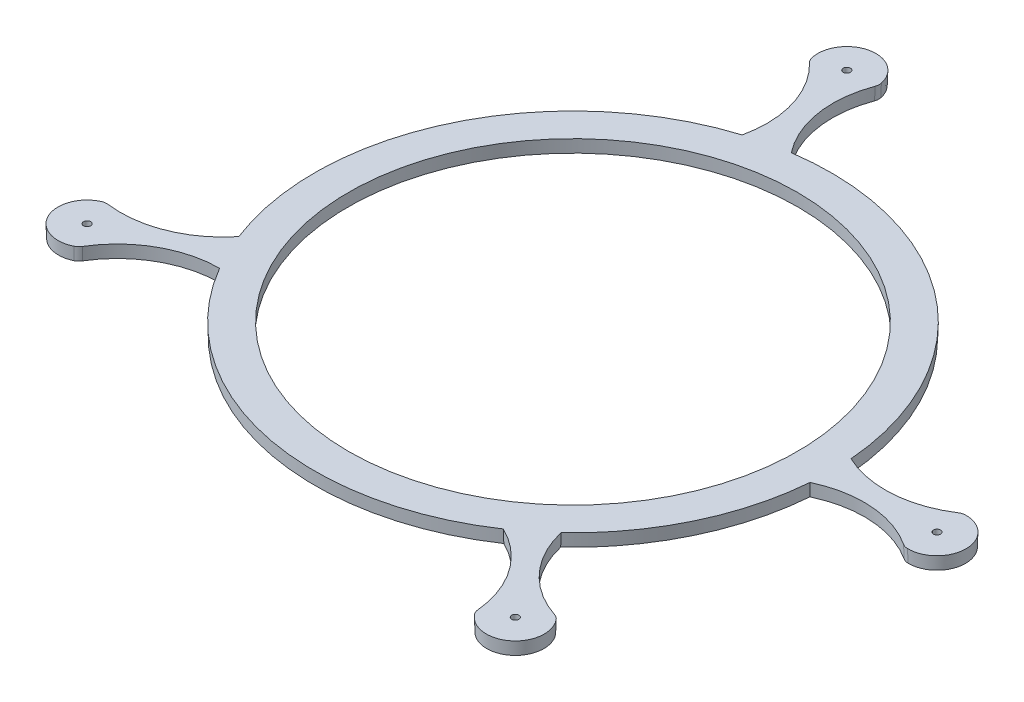
ISO-10303-21;
HEADER;
FILE_DESCRIPTION(('STEP AP214'),'2;1');
FILE_NAME('part.step','',(''),(''),'','','');
FILE_SCHEMA(('AUTOMOTIVE_DESIGN { 1 0 10303 214 1 1 1 1 }'));
ENDSEC;
DATA;
#1=APPLICATION_CONTEXT('core data for automotive mechanical design processes');
#2=APPLICATION_PROTOCOL_DEFINITION('international standard','automotive_design',2000,#1);
#3=PRODUCT_CONTEXT('',#1,'mechanical');
#4=PRODUCT('Part','Part','',(#3));
#5=PRODUCT_RELATED_PRODUCT_CATEGORY('part','',(#4));
#6=PRODUCT_DEFINITION_FORMATION('','',#4);
#7=PRODUCT_DEFINITION_CONTEXT('part definition',#1,'design');
#8=PRODUCT_DEFINITION('design','',#6,#7);
#9=PRODUCT_DEFINITION_SHAPE('','',#8);
#10=(LENGTH_UNIT() NAMED_UNIT(*) SI_UNIT(.MILLI.,.METRE.));
#11=(NAMED_UNIT(*) PLANE_ANGLE_UNIT() SI_UNIT($,.RADIAN.));
#12=(NAMED_UNIT(*) SI_UNIT($,.STERADIAN.) SOLID_ANGLE_UNIT());
#13=UNCERTAINTY_MEASURE_WITH_UNIT(LENGTH_MEASURE(1.E-05),#10,'distance_accuracy_value','');
#14=(GEOMETRIC_REPRESENTATION_CONTEXT(3) GLOBAL_UNCERTAINTY_ASSIGNED_CONTEXT((#13)) GLOBAL_UNIT_ASSIGNED_CONTEXT((#10,
#11,#12)) REPRESENTATION_CONTEXT('',''));
#15=CARTESIAN_POINT('',(0.,0.,0.));
#16=DIRECTION('',(0.,0.,1.));
#17=DIRECTION('',(1.,0.,0.));
#18=AXIS2_PLACEMENT_3D('',#15,#16,#17);
#19=CARTESIAN_POINT('',(0.,0.,0.));
#20=DIRECTION('',(0.,1.,0.));
#21=DIRECTION('',(0.,0.,1.));
#22=AXIS2_PLACEMENT_3D('',#19,#20,#21);
#23=CONICAL_SURFACE('',#22,63.5,0.0349065850398867);
#24=CARTESIAN_POINT('',(-8.47365887755398,49.046800738389,-64.6598803867296));
#25=CARTESIAN_POINT('',(-8.539047421525,44.9595926190922,-64.5073623180231));
#26=CARTESIAN_POINT('',(-8.60381314379772,40.8723777055365,-64.3547595359883));
#27=CARTESIAN_POINT('',(-8.73212595212953,32.6979352936555,-64.0493882466624));
#28=CARTESIAN_POINT('',(-8.79567303829411,28.6107077953313,-63.8966197393857));
#29=CARTESIAN_POINT('',(-8.92157559257824,20.4362405311925,-63.5909206753609));
#30=CARTESIAN_POINT('',(-8.98393106070393,16.3490007653779,-63.4379901186137));
#31=CARTESIAN_POINT('',(-9.10747515676641,8.17450918370875,-63.1319703237221));
#32=CARTESIAN_POINT('',(-9.1686637846022,4.08725736785326,-62.978881085564));
#33=CARTESIAN_POINT('',(-9.22928137565886,0.,-62.8257142043679));
#34=B_SPLINE_CURVE_WITH_KNOTS('',3,(#24,#25,#26,#27,#28,#29,#30,#31,#32,#33),.UNSPECIFIED.,.F.,
.F.,(4,2,2,2,4),(0.,12.2717263336298,24.5434516050845,36.8151768132926,49.0869030836614),.UNSPECIFIED.);
#35=CARTESIAN_POINT('',(-9.18207836544071,3.175,-62.9446793390006));
#36=VERTEX_POINT('',#35);
#37=CARTESIAN_POINT('',(-9.22928137565885,0.,-62.8257142043679));
#38=VERTEX_POINT('',#37);
#39=EDGE_CURVE('E65',#36,#38,#34,.T.);
#40=ORIENTED_EDGE('',*,*,#39,.F.);
#41=CARTESIAN_POINT('',(0.,3.175,0.));
#42=DIRECTION('',(0.,1.,0.));
#43=DIRECTION('',(0.,0.,1.));
#44=AXIS2_PLACEMENT_3D('',#41,#42,#43);
#45=CIRCLE('',#44,63.6108734431363);
#46=CARTESIAN_POINT('',(63.4097294644642,3.175,-5.05464434378554));
#47=VERTEX_POINT('',#46);
#48=EDGE_CURVE('E11',#47,#36,#45,.T.);
#49=ORIENTED_EDGE('',*,*,#48,.F.);
#50=CARTESIAN_POINT('',(63.4097294644642,3.175,-5.05464434378554));
#51=CARTESIAN_POINT('',(63.3921564897682,2.64583352104839,-5.04254423693743));
#52=CARTESIAN_POINT('',(63.3745801047194,2.11666694823912,-5.03045320309109));
#53=CARTESIAN_POINT('',(63.3394205139158,1.05833361490579,-5.00628928140196));
#54=CARTESIAN_POINT('',(63.3218373081612,0.529166854381727,-4.99421639355917));
#55=CARTESIAN_POINT('',(63.3042506920536,0.,-4.98215257871815));
#56=B_SPLINE_CURVE_WITH_KNOTS('',3,(#50,#51,#52,#53,#54,#55),.UNSPECIFIED.,.F.,.F.,(4,2,4),(0.,
1.58878930563687,3.17757861127216),.UNSPECIFIED.);
#57=CARTESIAN_POINT('',(63.3042506920536,0.,-4.98215257871816));
#58=VERTEX_POINT('',#57);
#59=EDGE_CURVE('E414',#47,#58,#56,.T.);
#60=ORIENTED_EDGE('',*,*,#59,.T.);
#61=CARTESIAN_POINT('',(0.,0.,0.));
#62=DIRECTION('',(0.,1.,0.));
#63=DIRECTION('',(0.,0.,1.));
#64=AXIS2_PLACEMENT_3D('',#61,#62,#63);
#65=CIRCLE('',#64,63.5);
#66=EDGE_CURVE('E384',#58,#38,#65,.T.);
#67=ORIENTED_EDGE('',*,*,#66,.T.);
#68=EDGE_LOOP('',(#40,#49,#60,#67));
#69=FACE_BOUND('',#68,.T.);
#70=ADVANCED_FACE('F39',(#69),#23,.T.);
#71=CARTESIAN_POINT('',(-19.0379060792577,3.175,-60.6951509786084));
#72=VERTEX_POINT('',#71);
#73=CARTESIAN_POINT('',(-59.3233201573882,3.175,22.9583733244044));
#74=VERTEX_POINT('',#73);
#75=EDGE_CURVE('E48',#72,#74,#45,.T.);
#76=ORIENTED_EDGE('',*,*,#75,.F.);
#77=CARTESIAN_POINT('',(-19.0379060792577,3.175,-60.6951509786084));
#78=CARTESIAN_POINT('',(-19.0221989926094,2.64583352104839,-60.6807111221541));
#79=CARTESIAN_POINT('',(-19.0064999926088,2.11666694823912,-60.6662659219186));
#80=CARTESIAN_POINT('',(-18.9751181659032,1.05833361490579,-60.6373648338857));
#81=CARTESIAN_POINT('',(-18.9594353391981,0.529166854381727,-60.6229089460882));
#82=CARTESIAN_POINT('',(-18.9437605991408,0.,-60.6084477145096));
#83=B_SPLINE_CURVE_WITH_KNOTS('',3,(#77,#78,#79,#80,#81,#82),.UNSPECIFIED.,.F.,.F.,(4,2,4),(0.,
1.58878930563687,3.17757861127216),.UNSPECIFIED.);
#84=CARTESIAN_POINT('',(-18.9437605991408,0.,-60.6084477145096));
#85=VERTEX_POINT('',#84);
#86=EDGE_CURVE('E280',#72,#85,#83,.T.);
#87=ORIENTED_EDGE('',*,*,#86,.T.);
#88=CARTESIAN_POINT('',(-59.1968340691391,0.,22.9779206237383));
#89=VERTEX_POINT('',#88);
#90=EDGE_CURVE('E324',#85,#89,#65,.T.);
#91=ORIENTED_EDGE('',*,*,#90,.T.);
#92=CARTESIAN_POINT('',(-61.1531556999002,49.046800738389,22.6493835311935));
#93=CARTESIAN_POINT('',(-60.9899112577316,44.9595926190922,22.679194184754));
#94=CARTESIAN_POINT('',(-60.8267228170408,40.8723777055365,22.7083787815676));
#95=CARTESIAN_POINT('',(-60.5004555375495,32.6979352936555,22.7655230153965));
#96=CARTESIAN_POINT('',(-60.3373766987396,28.6107077953313,22.7934826525178));
#97=CARTESIAN_POINT('',(-60.0113261945272,20.4362405311925,22.8482041256681));
#98=CARTESIAN_POINT('',(-59.8483545291241,16.3490007653779,22.8749659617031));
#99=CARTESIAN_POINT('',(-59.5225161417635,8.17450918370876,22.9273167387713));
#100=CARTESIAN_POINT('',(-59.3596494198151,4.08725736785326,22.9529056797029));
#101=CARTESIAN_POINT('',(-59.196834069139,0.,22.9779206237383));
#102=B_SPLINE_CURVE_WITH_KNOTS('',3,(#92,#93,#94,#95,#96,#97,#98,#99,#100,#101),.UNSPECIFIED.,
.F.,.F.,(4,2,2,2,4),(0.,12.2717263336298,24.5434516050845,36.8151768132926,49.0869030836614),.UNSPECIFIED.);
#103=EDGE_CURVE('E242',#74,#89,#102,.T.);
#104=ORIENTED_EDGE('',*,*,#103,.F.);
#105=EDGE_LOOP('',(#76,#87,#91,#104));
#106=FACE_BOUND('',#105,.T.);
#107=ADVANCED_FACE('F524',(#106),#23,.T.);
#108=CARTESIAN_POINT('',(-54.9370641818061,3.175,32.066527708544));
#109=VERTEX_POINT('',#108);
#110=CARTESIAN_POINT('',(35.5834395790641,3.175,52.7272419904721));
#111=VERTEX_POINT('',#110);
#112=EDGE_CURVE('E493',#109,#111,#45,.T.);
#113=ORIENTED_EDGE('',*,*,#112,.F.);
#114=CARTESIAN_POINT('',(-54.9370641818061,3.175,32.066527708544));
#115=CARTESIAN_POINT('',(-54.9264815182916,2.64583352104839,32.0480012610071));
#116=CARTESIAN_POINT('',(-54.9158918455273,2.11666694823913,32.0294815082656));
#117=CARTESIAN_POINT('',(-54.8946984814994,1.05833361490579,31.9924553923736));
#118=CARTESIAN_POINT('',(-54.8840947902357,0.529166854381726,31.9739490292231));
#119=CARTESIAN_POINT('',(-54.8734840897223,0.,31.955449360868));
#120=B_SPLINE_CURVE_WITH_KNOTS('',3,(#114,#115,#116,#117,#118,#119),.UNSPECIFIED.,.F.,.F.,(4,2,
4),(0.,1.58878930563687,3.17757861127217),.UNSPECIFIED.);
#121=CARTESIAN_POINT('',(-54.8734840897223,0.,31.955449360868));
#122=VERTEX_POINT('',#121);
#123=EDGE_CURVE('E211',#109,#122,#120,.T.);
#124=ORIENTED_EDGE('',*,*,#123,.T.);
#125=CARTESIAN_POINT('',(35.5743509843029,0.,52.5995774892311));
#126=VERTEX_POINT('',#125);
#127=EDGE_CURVE('E487',#122,#126,#65,.T.);
#128=ORIENTED_EDGE('',*,*,#127,.T.);
#129=CARTESIAN_POINT('',(35.6893735189898,49.046800738389,54.5799564329375));
#130=CARTESIAN_POINT('',(35.6821114514918,44.9595926190922,54.4141713752868));
#131=CARTESIAN_POINT('',(35.6742514852977,40.8723777055365,54.2485802257717));
#132=CARTESIAN_POINT('',(35.6573616941259,32.6979352936555,53.9177773598822));
#133=CARTESIAN_POINT('',(35.6483318692495,28.6107077953313,53.7525656434749));
#134=CARTESIAN_POINT('',(35.6291282981051,20.4362405311925,53.4225132328244));
#135=CARTESIAN_POINT('',(35.618954551843,16.3490007653779,53.2576725385793));
#136=CARTESIAN_POINT('',(35.5974869233569,8.17450918370876,52.9283544560747));
#137=CARTESIAN_POINT('',(35.5861930410359,4.08725736785327,52.7638770678465));
#138=CARTESIAN_POINT('',(35.5743509843029,0.,52.5995774892311));
#139=B_SPLINE_CURVE_WITH_KNOTS('',3,(#129,#130,#131,#132,#133,#134,#135,#136,#137,#138),
.UNSPECIFIED.,.F.,.F.,(4,2,2,2,4),(0.,12.2717263336298,24.5434516050845,36.8151768132926,
49.0869030836614),.UNSPECIFIED.);
#140=EDGE_CURVE('E365',#111,#126,#139,.T.);
#141=ORIENTED_EDGE('',*,*,#140,.F.);
#142=EDGE_LOOP('',(#113,#124,#128,#141));
#143=FACE_BOUND('',#142,.T.);
#144=ADVANCED_FACE('F492',(#143),#23,.T.);
#145=CARTESIAN_POINT('',(43.4871997403651,3.175,46.4242035897256));
#146=VERTEX_POINT('',#145);
#147=CARTESIAN_POINT('',(63.4097294644642,3.175,5.05464434378554));
#148=VERTEX_POINT('',#147);
#149=EDGE_CURVE('E50',#146,#148,#45,.T.);
#150=ORIENTED_EDGE('',*,*,#149,.F.);
#151=CARTESIAN_POINT('',(43.4871997403651,3.175,46.4242035897256));
#152=CARTESIAN_POINT('',(43.4667829253788,2.64583352104839,46.4180087780889));
#153=CARTESIAN_POINT('',(43.4463710776306,2.11666694823912,46.4118056432069));
#154=CARTESIAN_POINT('',(43.4055573166106,1.05833361490579,46.399382726952));
#155=CARTESIAN_POINT('',(43.3851554033388,0.529166854381726,46.3931629455793));
#156=CARTESIAN_POINT('',(43.3647584573052,0.,46.3869348409612));
#157=B_SPLINE_CURVE_WITH_KNOTS('',3,(#151,#152,#153,#154,#155,#156),.UNSPECIFIED.,.F.,.F.,(4,2,
4),(0.,1.58878930563687,3.17757861127217),.UNSPECIFIED.);
#158=CARTESIAN_POINT('',(43.3647584573052,0.,46.3869348409612));
#159=VERTEX_POINT('',#158);
#160=EDGE_CURVE('E437',#146,#159,#157,.T.);
#161=ORIENTED_EDGE('',*,*,#160,.T.);
#162=CARTESIAN_POINT('',(63.3042506920536,0.,4.98215257871815));
#163=VERTEX_POINT('',#162);
#164=EDGE_CURVE('E386',#159,#163,#65,.T.);
#165=ORIENTED_EDGE('',*,*,#164,.T.);
#166=CARTESIAN_POINT('',(64.9242886748213,49.046800738389,6.12697041512335));
#167=CARTESIAN_POINT('',(64.7901448724018,44.9595926190922,6.02928283537529));
#168=CARTESIAN_POINT('',(64.6557798897279,40.8723777055365,5.93218361139628));
#169=CARTESIAN_POINT('',(64.3866171821337,32.6979352936555,5.73913636855893));
#170=CARTESIAN_POINT('',(64.2518194572509,28.6107077953313,5.64318834960094));
#171=CARTESIAN_POINT('',(63.981800860972,20.4362405311925,5.45241799397799));
#172=CARTESIAN_POINT('',(63.8465799895782,16.3490007653779,5.35759565730723));
#173=CARTESIAN_POINT('',(63.5757238974988,8.17450918370876,5.16905325910225));
#174=CARTESIAN_POINT('',(63.4400886767774,4.08725736785328,5.07533319766345));
#175=CARTESIAN_POINT('',(63.3042506920536,0.,4.98215257871815));
#176=B_SPLINE_CURVE_WITH_KNOTS('',3,(#166,#167,#168,#169,#170,#171,#172,#173,#174,#175),
.UNSPECIFIED.,.F.,.F.,(4,2,2,2,4),(0.,12.2717263336298,24.5434516050845,36.8151768132926,
49.0869030836614),.UNSPECIFIED.);
#177=EDGE_CURVE('E383',#148,#163,#176,.T.);
#178=ORIENTED_EDGE('',*,*,#177,.F.);
#179=EDGE_LOOP('',(#150,#161,#165,#178));
#180=FACE_BOUND('',#179,.T.);
#181=ADVANCED_FACE('F246',(#180),#23,.T.);
#182=CARTESIAN_POINT('',(0.,3.175,0.));
#183=DIRECTION('',(0.,1.,0.));
#184=DIRECTION('',(0.,0.,1.));
#185=AXIS2_PLACEMENT_3D('',#182,#183,#184);
#186=PLANE('',#185);
#187=CARTESIAN_POINT('',(-19.9433819321121,3.175,-87.3776653873685));
#188=DIRECTION('',(0.,1.,0.));
#189=DIRECTION('',(0.974927912181826,0.,-0.222520933956305));
#190=AXIS2_PLACEMENT_3D('',#187,#188,#189);
#191=CIRCLE('',#190,0.889000000000003);
#192=CARTESIAN_POINT('',(-19.0766710181824,3.175,-87.5754864976557));
#193=VERTEX_POINT('',#192);
#194=EDGE_CURVE('E789',#193,#193,#191,.T.);
#195=ORIENTED_EDGE('',*,*,#194,.F.);
#196=EDGE_LOOP('',(#195));
#197=FACE_BOUND('',#196,.T.);
#198=CARTESIAN_POINT('',(-80.749104913648,3.175,38.8867194178386));
#199=DIRECTION('',(0.,1.,0.));
#200=DIRECTION('',(-0.433883739117553,0.,-0.900968867902422));
#201=AXIS2_PLACEMENT_3D('',#198,#199,#200);
#202=CIRCLE('',#201,0.889000000000003);
#203=CARTESIAN_POINT('',(-81.1348275577235,3.175,38.0857580942733));
#204=VERTEX_POINT('',#203);
#205=EDGE_CURVE('E784',#204,#204,#202,.T.);
#206=ORIENTED_EDGE('',*,*,#205,.F.);
#207=EDGE_LOOP('',(#206));
#208=FACE_BOUND('',#207,.T.);
#209=CARTESIAN_POINT('',(55.8801144151554,3.175,70.0714471406591));
#210=DIRECTION('',(0.,1.,0.));
#211=DIRECTION('',(-0.781831482468031,0.,0.623489801858732));
#212=AXIS2_PLACEMENT_3D('',#209,#210,#211);
#213=CIRCLE('',#212,0.889000000000003);
#214=CARTESIAN_POINT('',(55.1850662272413,3.175,70.6257295745115));
#215=VERTEX_POINT('',#214);
#216=EDGE_CURVE('E328',#215,#215,#213,.T.);
#217=ORIENTED_EDGE('',*,*,#216,.F.);
#218=EDGE_LOOP('',(#217));
#219=FACE_BOUND('',#218,.T.);
#220=ORIENTED_EDGE('',*,*,#48,.T.);
#221=CARTESIAN_POINT('',(10.6601417901242,3.175,-78.6235256392601));
#222=DIRECTION('',(0.,1.,0.));
#223=DIRECTION('',(0.,0.,1.));
#224=AXIS2_PLACEMENT_3D('',#221,#222,#223);
#225=CIRCLE('',#224,25.2891265568637);
#226=CARTESIAN_POINT('',(-13.0561756989304,3.175,-87.4028312363691));
#227=VERTEX_POINT('',#226);
#228=EDGE_CURVE('E282',#36,#227,#225,.F.);
#229=ORIENTED_EDGE('',*,*,#228,.T.);
#230=CARTESIAN_POINT('',(-15.5421831163618,3.175,-88.3231013771437));
#231=DIRECTION('',(0.,1.,0.));
#232=DIRECTION('',(0.,0.,1.));
#233=AXIS2_PLACEMENT_3D('',#230,#231,#232);
#234=CIRCLE('',#233,2.6508734431363);
#235=CARTESIAN_POINT('',(-12.950433131829,3.175,-88.8798437135971));
#236=VERTEX_POINT('',#235);
#237=EDGE_CURVE('E284',#227,#236,#234,.T.);
#238=ORIENTED_EDGE('',*,*,#237,.T.);
#239=CARTESIAN_POINT('',(-19.9433819321121,3.175,-87.3776653873685));
#240=DIRECTION('',(0.,1.,0.));
#241=DIRECTION('',(0.,0.,1.));
#242=AXIS2_PLACEMENT_3D('',#239,#240,#241);
#243=CIRCLE('',#242,7.15247318395328);
#244=CARTESIAN_POINT('',(-26.8955818450081,3.175,-85.6969545204139));
#245=VERTEX_POINT('',#244);
#246=EDGE_CURVE('E286',#236,#245,#243,.T.);
#247=ORIENTED_EDGE('',*,*,#246,.T.);
#248=CARTESIAN_POINT('',(-24.318934348892,3.175,-86.3198651819731));
#249=DIRECTION('',(0.,1.,0.));
#250=DIRECTION('',(0.,0.,1.));
#251=AXIS2_PLACEMENT_3D('',#248,#249,#250);
#252=CIRCLE('',#251,2.6508734431363);
#253=CARTESIAN_POINT('',(-26.1594593876947,3.175,-84.4120922413259));
#254=VERTEX_POINT('',#253);
#255=EDGE_CURVE('E288',#254,#245,#252,.F.);
#256=ORIENTED_EDGE('',*,*,#255,.F.);
#257=CARTESIAN_POINT('',(-43.7179251672936,3.175,-66.2120867062794));
#258=DIRECTION('',(0.,1.,0.));
#259=DIRECTION('',(0.,0.,1.));
#260=AXIS2_PLACEMENT_3D('',#257,#258,#259);
#261=CIRCLE('',#260,25.2891265568637);
#262=EDGE_CURVE('E86',#72,#254,#261,.T.);
#263=ORIENTED_EDGE('',*,*,#262,.F.);
#264=ORIENTED_EDGE('',*,*,#75,.T.);
#265=CARTESIAN_POINT('',(-79.0243744071031,3.175,7.10251057717865));
#266=DIRECTION('',(0.,1.,0.));
#267=DIRECTION('',(0.,0.,1.));
#268=AXIS2_PLACEMENT_3D('',#265,#266,#267);
#269=CIRCLE('',#268,25.2891265568637);
#270=CARTESIAN_POINT('',(-82.3061873656297,3.175,32.1777897523806));
#271=VERTEX_POINT('',#270);
#272=EDGE_CURVE('E224',#74,#271,#269,.F.);
#273=ORIENTED_EDGE('',*,*,#272,.T.);
#274=CARTESIAN_POINT('',(-82.6501957202693,3.175,34.8062471447428));
#275=DIRECTION('',(0.,1.,0.));
#276=DIRECTION('',(0.,0.,1.));
#277=AXIS2_PLACEMENT_3D('',#274,#275,#276);
#278=CIRCLE('',#277,2.6508734431363);
#279=CARTESIAN_POINT('',(-83.7696979911105,3.175,32.4033645681056));
#280=VERTEX_POINT('',#279);
#281=EDGE_CURVE('E232',#271,#280,#278,.T.);
#282=ORIENTED_EDGE('',*,*,#281,.T.);
#283=CARTESIAN_POINT('',(-80.749104913648,3.175,38.8867194178386));
#284=DIRECTION('',(0.,1.,0.));
#285=DIRECTION('',(0.,0.,1.));
#286=AXIS2_PLACEMENT_3D('',#283,#284,#285);
#287=CIRCLE('',#286,7.15247318395328);
#288=CARTESIAN_POINT('',(-77.563522959478,3.175,45.2906198121637));
#289=VERTEX_POINT('',#288);
#290=EDGE_CURVE('E229',#280,#289,#287,.T.);
#291=ORIENTED_EDGE('',*,*,#290,.T.);
#292=CARTESIAN_POINT('',(-78.7441739575397,3.175,42.9171849105282));
#293=DIRECTION('',(0.,1.,0.));
#294=DIRECTION('',(0.,0.,1.));
#295=AXIS2_PLACEMENT_3D('',#292,#293,#294);
#296=CIRCLE('',#295,2.6508734431363);
#297=CARTESIAN_POINT('',(-76.4746775169931,3.175,44.287044727397));
#298=VERTEX_POINT('',#297);
#299=EDGE_CURVE('E214',#298,#289,#296,.F.);
#300=ORIENTED_EDGE('',*,*,#299,.F.);
#301=CARTESIAN_POINT('',(-54.8238579148962,3.175,57.3554008813487));
#302=DIRECTION('',(0.,1.,0.));
#303=DIRECTION('',(0.,0.,1.));
#304=AXIS2_PLACEMENT_3D('',#301,#302,#303);
#305=CIRCLE('',#304,25.2891265568637);
#306=EDGE_CURVE('E204',#109,#298,#305,.T.);
#307=ORIENTED_EDGE('',*,*,#306,.F.);
#308=ORIENTED_EDGE('',*,*,#112,.T.);
#309=CARTESIAN_POINT('',(24.5090134066405,3.175,75.4626110651233));
#310=DIRECTION('',(0.,1.,0.));
#311=DIRECTION('',(0.,0.,1.));
#312=AXIS2_PLACEMENT_3D('',#309,#310,#311);
#313=CIRCLE('',#312,25.2891265568637);
#314=CARTESIAN_POINT('',(49.6858750648977,3.175,73.0823675796695));
#315=VERTEX_POINT('',#314);
#316=EDGE_CURVE('E438',#111,#315,#313,.F.);
#317=ORIENTED_EDGE('',*,*,#316,.T.);
#318=CARTESIAN_POINT('',(52.3249806030554,3.175,72.8328641328185));
#319=DIRECTION('',(0.,1.,0.));
#320=DIRECTION('',(0.,0.,1.));
#321=AXIS2_PLACEMENT_3D('',#318,#319,#320);
#322=CIRCLE('',#321,2.6508734431363);
#323=CARTESIAN_POINT('',(50.2314560002703,3.175,74.4589898195533));
#324=VERTEX_POINT('',#323);
#325=EDGE_CURVE('E809',#315,#324,#322,.T.);
#326=ORIENTED_EDGE('',*,*,#325,.T.);
#327=CARTESIAN_POINT('',(55.8801144151554,3.175,70.0714471406591));
#328=DIRECTION('',(0.,1.,0.));
#329=DIRECTION('',(0.,0.,1.));
#330=AXIS2_PLACEMENT_3D('',#327,#328,#329);
#331=CIRCLE('',#330,7.15247318395328);
#332=CARTESIAN_POINT('',(61.4145969847788,3.175,65.5407324802876));
#333=VERTEX_POINT('',#332);
#334=EDGE_CURVE('E808',#324,#333,#331,.T.);
#335=ORIENTED_EDGE('',*,*,#334,.T.);
#336=CARTESIAN_POINT('',(59.363388614193,3.175,67.2199210438396));
#337=DIRECTION('',(0.,1.,0.));
#338=DIRECTION('',(0.,0.,1.));
#339=AXIS2_PLACEMENT_3D('',#336,#337,#338);
#340=CIRCLE('',#339,2.6508734431363);
#341=CARTESIAN_POINT('',(60.1938927178737,3.175,64.7025031315146));
#342=VERTEX_POINT('',#341);
#343=EDGE_CURVE('E807',#342,#333,#340,.F.);
#344=ORIENTED_EDGE('',*,*,#343,.F.);
#345=CARTESIAN_POINT('',(68.116837299916,3.175,40.6865319631659));
#346=DIRECTION('',(0.,1.,0.));
#347=DIRECTION('',(0.,0.,1.));
#348=AXIS2_PLACEMENT_3D('',#345,#346,#347);
#349=CIRCLE('',#348,25.2891265568637);
#350=EDGE_CURVE('E357',#146,#342,#349,.T.);
#351=ORIENTED_EDGE('',*,*,#350,.F.);
#352=ORIENTED_EDGE('',*,*,#149,.T.);
#353=CARTESIAN_POINT('',(74.280164992613,3.175,27.8882501351937));
#354=DIRECTION('',(0.,1.,0.));
#355=DIRECTION('',(0.,0.,1.));
#356=AXIS2_PLACEMENT_3D('',#353,#354,#355);
#357=CIRCLE('',#356,25.2891265568637);
#358=CARTESIAN_POINT('',(88.1167321864774,3.175,6.7201295219048));
#359=VERTEX_POINT('',#358);
#360=EDGE_CURVE('E396',#148,#359,#357,.F.);
#361=ORIENTED_EDGE('',*,*,#360,.T.);
#362=CARTESIAN_POINT('',(89.5671179258152,3.175,4.50123087197718));
#363=DIRECTION('',(0.,1.,0.));
#364=DIRECTION('',(0.,0.,1.));
#365=AXIS2_PLACEMENT_3D('',#362,#363,#364);
#366=CIRCLE('',#365,2.6508734431363);
#367=CARTESIAN_POINT('',(89.5331829423775,3.175,7.15188709797564));
#368=VERTEX_POINT('',#367);
#369=EDGE_CURVE('E504',#359,#368,#366,.T.);
#370=ORIENTED_EDGE('',*,*,#369,.T.);
#371=CARTESIAN_POINT('',(89.6247448612103,3.175,0.));
#372=DIRECTION('',(0.,1.,0.));
#373=DIRECTION('',(0.,0.,1.));
#374=AXIS2_PLACEMENT_3D('',#371,#372,#373);
#375=CIRCLE('',#374,7.15247318395328);
#376=CARTESIAN_POINT('',(89.5331829423775,3.175,-7.15188709797564));
#377=VERTEX_POINT('',#376);
#378=EDGE_CURVE('E505',#368,#377,#375,.T.);
#379=ORIENTED_EDGE('',*,*,#378,.T.);
#380=CARTESIAN_POINT('',(89.5671179258152,3.175,-4.50123087197718));
#381=DIRECTION('',(0.,1.,0.));
#382=DIRECTION('',(0.,0.,1.));
#383=AXIS2_PLACEMENT_3D('',#380,#381,#382);
#384=CIRCLE('',#383,2.6508734431363);
#385=CARTESIAN_POINT('',(88.1167321864774,3.175,-6.72012952190481));
#386=VERTEX_POINT('',#385);
#387=EDGE_CURVE('E507',#386,#377,#384,.F.);
#388=ORIENTED_EDGE('',*,*,#387,.F.);
#389=CARTESIAN_POINT('',(74.280164992613,3.175,-27.8882501351937));
#390=DIRECTION('',(0.,1.,0.));
#391=DIRECTION('',(0.,0.,1.));
#392=AXIS2_PLACEMENT_3D('',#389,#390,#391);
#393=CIRCLE('',#392,25.2891265568637);
#394=EDGE_CURVE('E378',#47,#386,#393,.T.);
#395=ORIENTED_EDGE('',*,*,#394,.F.);
#396=EDGE_LOOP('',(#220,#229,#238,#247,#256,#263,#264,#273,#282,#291,#300,#307,#308,#317,#326,
#335,#344,#351,#352,#361,#370,#379,#388,#395));
#397=FACE_BOUND('',#396,.T.);
#398=CARTESIAN_POINT('',(0.,3.175,0.));
#399=DIRECTION('',(0.,1.,0.));
#400=DIRECTION('',(0.,0.,1.));
#401=AXIS2_PLACEMENT_3D('',#398,#399,#400);
#402=CIRCLE('',#401,55.2611265568637);
#403=CARTESIAN_POINT('',(0.,3.175,55.2611265568637));
#404=VERTEX_POINT('',#403);
#405=EDGE_CURVE('E382',#404,#404,#402,.T.);
#406=ORIENTED_EDGE('',*,*,#405,.F.);
#407=EDGE_LOOP('',(#406));
#408=FACE_BOUND('',#407,.T.);
#409=CARTESIAN_POINT('',(89.6247448612103,3.175,0.));
#410=DIRECTION('',(0.,1.,0.));
#411=DIRECTION('',(0.,0.,1.));
#412=AXIS2_PLACEMENT_3D('',#409,#410,#411);
#413=CIRCLE('',#412,0.889000000000003);
#414=CARTESIAN_POINT('',(89.6247448612103,3.175,0.889000000000004));
#415=VERTEX_POINT('',#414);
#416=EDGE_CURVE('E362',#415,#415,#413,.T.);
#417=ORIENTED_EDGE('',*,*,#416,.F.);
#418=EDGE_LOOP('',(#417));
#419=FACE_BOUND('',#418,.T.);
#420=ADVANCED_FACE('F226',(#197,#208,#219,#397,#408,#419),#186,.T.);
#421=CARTESIAN_POINT('',(0.,0.,0.));
#422=DIRECTION('',(0.,1.,0.));
#423=DIRECTION('',(0.,0.,1.));
#424=AXIS2_PLACEMENT_3D('',#421,#422,#423);
#425=PLANE('',#424);
#426=CARTESIAN_POINT('',(-19.9433819321121,0.,-87.3776653873685));
#427=DIRECTION('',(0.,1.,0.));
#428=DIRECTION('',(0.974927912181826,0.,-0.222520933956305));
#429=AXIS2_PLACEMENT_3D('',#426,#427,#428);
#430=CIRCLE('',#429,0.889000000000003);
#431=CARTESIAN_POINT('',(-19.0766710181824,0.,-87.5754864976557));
#432=VERTEX_POINT('',#431);
#433=EDGE_CURVE('E769',#432,#432,#430,.T.);
#434=ORIENTED_EDGE('',*,*,#433,.T.);
#435=EDGE_LOOP('',(#434));
#436=FACE_BOUND('',#435,.T.);
#437=CARTESIAN_POINT('',(-80.749104913648,0.,38.8867194178386));
#438=DIRECTION('',(0.,1.,0.));
#439=DIRECTION('',(-0.433883739117553,0.,-0.900968867902422));
#440=AXIS2_PLACEMENT_3D('',#437,#438,#439);
#441=CIRCLE('',#440,0.889000000000003);
#442=CARTESIAN_POINT('',(-81.1348275577235,0.,38.0857580942733));
#443=VERTEX_POINT('',#442);
#444=EDGE_CURVE('E773',#443,#443,#441,.T.);
#445=ORIENTED_EDGE('',*,*,#444,.T.);
#446=EDGE_LOOP('',(#445));
#447=FACE_BOUND('',#446,.T.);
#448=CARTESIAN_POINT('',(55.8801144151554,0.,70.0714471406591));
#449=DIRECTION('',(0.,1.,0.));
#450=DIRECTION('',(-0.781831482468031,0.,0.623489801858732));
#451=AXIS2_PLACEMENT_3D('',#448,#449,#450);
#452=CIRCLE('',#451,0.889000000000003);
#453=CARTESIAN_POINT('',(55.1850662272413,0.,70.6257295745115));
#454=VERTEX_POINT('',#453);
#455=EDGE_CURVE('E325',#454,#454,#452,.T.);
#456=ORIENTED_EDGE('',*,*,#455,.T.);
#457=EDGE_LOOP('',(#456));
#458=FACE_BOUND('',#457,.T.);
#459=CARTESIAN_POINT('',(89.6247448612103,0.,0.));
#460=DIRECTION('',(0.,1.,0.));
#461=DIRECTION('',(0.,0.,1.));
#462=AXIS2_PLACEMENT_3D('',#459,#460,#461);
#463=CIRCLE('',#462,0.889000000000003);
#464=CARTESIAN_POINT('',(89.6247448612103,0.,0.889000000000004));
#465=VERTEX_POINT('',#464);
#466=EDGE_CURVE('E358',#465,#465,#463,.T.);
#467=ORIENTED_EDGE('',*,*,#466,.T.);
#468=EDGE_LOOP('',(#467));
#469=FACE_BOUND('',#468,.T.);
#470=ORIENTED_EDGE('',*,*,#66,.F.);
#471=CARTESIAN_POINT('',(74.280164992613,0.,-27.8882501351937));
#472=DIRECTION('',(0.,-1.,0.));
#473=DIRECTION('',(0.,0.,-1.));
#474=AXIS2_PLACEMENT_3D('',#471,#472,#473);
#475=CIRCLE('',#474,25.4);
#476=CARTESIAN_POINT('',(88.1773949318878,0.,-6.62732353226959));
#477=VERTEX_POINT('',#476);
#478=EDGE_CURVE('E361',#58,#477,#475,.F.);
#479=ORIENTED_EDGE('',*,*,#478,.T.);
#480=CARTESIAN_POINT('',(89.5671179258152,0.,-4.50123087197718));
#481=DIRECTION('',(0.,-1.,0.));
#482=DIRECTION('',(0.,0.,-1.));
#483=AXIS2_PLACEMENT_3D('',#480,#481,#482);
#484=CIRCLE('',#483,2.54);
#485=CARTESIAN_POINT('',(89.5346022815263,0.,-7.04102274000032));
#486=VERTEX_POINT('',#485);
#487=EDGE_CURVE('E368',#477,#486,#484,.T.);
#488=ORIENTED_EDGE('',*,*,#487,.T.);
#489=CARTESIAN_POINT('',(89.6247448612103,0.,0.));
#490=DIRECTION('',(0.,-1.,0.));
#491=DIRECTION('',(0.,0.,-1.));
#492=AXIS2_PLACEMENT_3D('',#489,#490,#491);
#493=CIRCLE('',#492,7.04159974081698);
#494=CARTESIAN_POINT('',(89.5346022815263,0.,7.04102274000033));
#495=VERTEX_POINT('',#494);
#496=EDGE_CURVE('E371',#495,#486,#493,.F.);
#497=ORIENTED_EDGE('',*,*,#496,.F.);
#498=CARTESIAN_POINT('',(89.5671179258152,0.,4.50123087197718));
#499=DIRECTION('',(0.,-1.,0.));
#500=DIRECTION('',(0.,0.,-1.));
#501=AXIS2_PLACEMENT_3D('',#498,#499,#500);
#502=CIRCLE('',#501,2.54);
#503=CARTESIAN_POINT('',(88.1773949318878,0.,6.6273235322696));
#504=VERTEX_POINT('',#503);
#505=EDGE_CURVE('E374',#504,#495,#502,.F.);
#506=ORIENTED_EDGE('',*,*,#505,.F.);
#507=CARTESIAN_POINT('',(74.280164992613,0.,27.8882501351937));
#508=DIRECTION('',(0.,-1.,0.));
#509=DIRECTION('',(0.,0.,-1.));
#510=AXIS2_PLACEMENT_3D('',#507,#508,#509);
#511=CIRCLE('',#510,25.4);
#512=EDGE_CURVE('E376',#163,#504,#511,.T.);
#513=ORIENTED_EDGE('',*,*,#512,.F.);
#514=ORIENTED_EDGE('',*,*,#164,.F.);
#515=CARTESIAN_POINT('',(68.116837299916,0.,40.6865319631659));
#516=DIRECTION('',(0.,-1.,0.));
#517=DIRECTION('',(0.781831482468031,0.,-0.623489801858732));
#518=AXIS2_PLACEMENT_3D('',#515,#516,#517);
#519=CIRCLE('',#518,25.4);
#520=CARTESIAN_POINT('',(60.1591566765315,0.,64.8077947637784));
#521=VERTEX_POINT('',#520);
#522=EDGE_CURVE('E344',#159,#521,#519,.F.);
#523=ORIENTED_EDGE('',*,*,#522,.T.);
#524=CARTESIAN_POINT('',(59.363388614193,0.,67.2199210438396));
#525=DIRECTION('',(0.,-1.,0.));
#526=DIRECTION('',(0.781831482468031,0.,-0.623489801858732));
#527=AXIS2_PLACEMENT_3D('',#524,#525,#526);
#528=CIRCLE('',#527,2.54);
#529=CARTESIAN_POINT('',(61.3288046829148,0.,65.6109649609057));
#530=VERTEX_POINT('',#529);
#531=EDGE_CURVE('E347',#521,#530,#528,.T.);
#532=ORIENTED_EDGE('',*,*,#531,.T.);
#533=CARTESIAN_POINT('',(55.8801144151554,0.,70.0714471406591));
#534=DIRECTION('',(0.,-1.,0.));
#535=DIRECTION('',(0.781831482468031,0.,-0.623489801858732));
#536=AXIS2_PLACEMENT_3D('',#533,#534,#535);
#537=CIRCLE('',#536,7.04159974081698);
#538=CARTESIAN_POINT('',(50.3190181891037,0.,74.3909767069969));
#539=VERTEX_POINT('',#538);
#540=EDGE_CURVE('E350',#539,#530,#537,.F.);
#541=ORIENTED_EDGE('',*,*,#540,.F.);
#542=CARTESIAN_POINT('',(52.3249806030554,0.,72.8328641328185));
#543=DIRECTION('',(0.,-1.,0.));
#544=DIRECTION('',(0.781831482468031,0.,-0.623489801858732));
#545=AXIS2_PLACEMENT_3D('',#542,#543,#544);
#546=CIRCLE('',#545,2.54);
#547=CARTESIAN_POINT('',(49.7962563124723,0.,73.0719320357554));
#548=VERTEX_POINT('',#547);
#549=EDGE_CURVE('E353',#548,#539,#546,.F.);
#550=ORIENTED_EDGE('',*,*,#549,.F.);
#551=CARTESIAN_POINT('',(24.5090134066405,0.,75.4626110651233));
#552=DIRECTION('',(0.,-1.,0.));
#553=DIRECTION('',(0.781831482468031,0.,-0.623489801858732));
#554=AXIS2_PLACEMENT_3D('',#551,#552,#553);
#555=CIRCLE('',#554,25.4);
#556=EDGE_CURVE('E355',#126,#548,#555,.T.);
#557=ORIENTED_EDGE('',*,*,#556,.F.);
#558=ORIENTED_EDGE('',*,*,#127,.F.);
#559=CARTESIAN_POINT('',(-54.8238579148962,0.,57.3554008813487));
#560=DIRECTION('',(0.,-1.,0.));
#561=DIRECTION('',(0.433883739117553,0.,0.900968867902422));
#562=AXIS2_PLACEMENT_3D('',#559,#560,#561);
#563=CIRCLE('',#562,25.4);
#564=CARTESIAN_POINT('',(-76.5695997718448,0.,44.2297499987846));
#565=VERTEX_POINT('',#564);
#566=EDGE_CURVE('E279',#122,#565,#563,.F.);
#567=ORIENTED_EDGE('',*,*,#566,.T.);
#568=CARTESIAN_POINT('',(-78.7441739575397,0.,42.9171849105282));
#569=DIRECTION('',(0.,-1.,0.));
#570=DIRECTION('',(0.433883739117553,0.,0.900968867902422));
#571=AXIS2_PLACEMENT_3D('',#568,#569,#570);
#572=CIRCLE('',#571,2.54);
#573=CARTESIAN_POINT('',(-77.6129039820373,0.,45.1913503052449));
#574=VERTEX_POINT('',#573);
#575=EDGE_CURVE('E221',#565,#574,#572,.T.);
#576=ORIENTED_EDGE('',*,*,#575,.T.);
#577=CARTESIAN_POINT('',(-80.749104913648,0.,38.8867194178386));
#578=DIRECTION('',(0.,-1.,0.));
#579=DIRECTION('',(0.433883739117553,0.,0.900968867902422));
#580=AXIS2_PLACEMENT_3D('',#577,#578,#579);
#581=CIRCLE('',#580,7.04159974081698);
#582=CARTESIAN_POINT('',(-83.7228745293234,0.,32.5038657313783));
#583=VERTEX_POINT('',#582);
#584=EDGE_CURVE('E338',#583,#574,#581,.F.);
#585=ORIENTED_EDGE('',*,*,#584,.F.);
#586=CARTESIAN_POINT('',(-82.6501957202693,0.,34.8062471447428));
#587=DIRECTION('',(0.,-1.,0.));
#588=DIRECTION('',(0.433883739117553,0.,0.900968867902422));
#589=AXIS2_PLACEMENT_3D('',#586,#587,#588);
#590=CIRCLE('',#589,2.54);
#591=CARTESIAN_POINT('',(-82.3205756008905,0.,32.2877256386006));
#592=VERTEX_POINT('',#591);
#593=EDGE_CURVE('E341',#592,#583,#590,.F.);
#594=ORIENTED_EDGE('',*,*,#593,.F.);
#595=CARTESIAN_POINT('',(-79.0243744071031,0.,7.10251057717865));
#596=DIRECTION('',(0.,-1.,0.));
#597=DIRECTION('',(0.433883739117553,0.,0.900968867902422));
#598=AXIS2_PLACEMENT_3D('',#595,#596,#597);
#599=CIRCLE('',#598,25.4);
#600=EDGE_CURVE('E215',#89,#592,#599,.T.);
#601=ORIENTED_EDGE('',*,*,#600,.F.);
#602=ORIENTED_EDGE('',*,*,#90,.F.);
#603=CARTESIAN_POINT('',(-43.7179251672936,0.,-66.2120867062794));
#604=DIRECTION('',(0.,-1.,0.));
#605=DIRECTION('',(-0.974927912181826,0.,0.222520933956305));
#606=AXIS2_PLACEMENT_3D('',#603,#604,#605);
#607=CIRCLE('',#606,25.4);
#608=CARTESIAN_POINT('',(-26.0824789687467,0.,-84.4918853205464));
#609=VERTEX_POINT('',#608);
#610=EDGE_CURVE('E310',#85,#609,#607,.F.);
#611=ORIENTED_EDGE('',*,*,#610,.T.);
#612=CARTESIAN_POINT('',(-24.318934348892,0.,-86.3198651819731));
#613=DIRECTION('',(0.,-1.,0.));
#614=DIRECTION('',(-0.974927912181826,0.,0.222520933956305));
#615=AXIS2_PLACEMENT_3D('',#612,#613,#614);
#616=CIRCLE('',#615,2.54);
#617=CARTESIAN_POINT('',(-26.7878129206248,0.,-85.7230079142462));
#618=VERTEX_POINT('',#617);
#619=EDGE_CURVE('E314',#609,#618,#616,.T.);
#620=ORIENTED_EDGE('',*,*,#619,.T.);
#621=CARTESIAN_POINT('',(-19.9433819321121,0.,-87.3776653873685));
#622=DIRECTION('',(0.,-1.,0.));
#623=DIRECTION('',(-0.974927912181826,0.,0.222520933956305));
#624=AXIS2_PLACEMENT_3D('',#621,#622,#623);
#625=CIRCLE('',#624,7.04159974081698);
#626=CARTESIAN_POINT('',(-13.0588337215583,0.,-88.8565578264711));
#627=VERTEX_POINT('',#626);
#628=EDGE_CURVE('E318',#627,#618,#625,.F.);
#629=ORIENTED_EDGE('',*,*,#628,.F.);
#630=CARTESIAN_POINT('',(-15.5421831163618,0.,-88.3231013771437));
#631=DIRECTION('',(0.,-1.,0.));
#632=DIRECTION('',(-0.974927912181826,0.,0.222520933956305));
#633=AXIS2_PLACEMENT_3D('',#630,#631,#632);
#634=CIRCLE('',#633,2.54);
#635=CARTESIAN_POINT('',(-13.1601535794085,0.,-87.4413217646089));
#636=VERTEX_POINT('',#635);
#637=EDGE_CURVE('E333',#636,#627,#634,.F.);
#638=ORIENTED_EDGE('',*,*,#637,.F.);
#639=CARTESIAN_POINT('',(10.6601417901242,0.,-78.6235256392601));
#640=DIRECTION('',(0.,-1.,0.));
#641=DIRECTION('',(-0.974927912181826,0.,0.222520933956305));
#642=AXIS2_PLACEMENT_3D('',#639,#640,#641);
#643=CIRCLE('',#642,25.4);
#644=EDGE_CURVE('E94',#38,#636,#643,.T.);
#645=ORIENTED_EDGE('',*,*,#644,.F.);
#646=EDGE_LOOP('',(#470,#479,#488,#497,#506,#513,#514,#523,#532,#541,#550,#557,#558,#567,#576,
#585,#594,#601,#602,#611,#620,#629,#638,#645));
#647=FACE_BOUND('',#646,.T.);
#648=CARTESIAN_POINT('',(0.,0.,0.));
#649=DIRECTION('',(0.,1.,0.));
#650=DIRECTION('',(0.,0.,1.));
#651=AXIS2_PLACEMENT_3D('',#648,#649,#650);
#652=CIRCLE('',#651,55.372);
#653=CARTESIAN_POINT('',(0.,0.,55.372));
#654=VERTEX_POINT('',#653);
#655=EDGE_CURVE('E379',#654,#654,#652,.T.);
#656=ORIENTED_EDGE('',*,*,#655,.T.);
#657=EDGE_LOOP('',(#656));
#658=FACE_BOUND('',#657,.T.);
#659=ADVANCED_FACE('F321',(#436,#447,#458,#469,#647,#658),#425,.F.);
#660=CARTESIAN_POINT('',(0.,0.,0.));
#661=DIRECTION('',(0.,-1.,0.));
#662=DIRECTION('',(0.,0.,1.));
#663=AXIS2_PLACEMENT_3D('',#660,#661,#662);
#664=CONICAL_SURFACE('',#663,55.372,0.0349065850398867);
#665=ORIENTED_EDGE('',*,*,#405,.T.);
#666=EDGE_LOOP('',(#665));
#667=FACE_BOUND('',#666,.T.);
#668=ORIENTED_EDGE('',*,*,#655,.F.);
#669=EDGE_LOOP('',(#668));
#670=FACE_BOUND('',#669,.T.);
#671=ADVANCED_FACE('F403',(#667,#670),#664,.F.);
#672=CARTESIAN_POINT('',(74.280164992613,0.,27.8882501351937));
#673=DIRECTION('',(0.,-1.,0.));
#674=DIRECTION('',(0.,0.,-1.));
#675=AXIS2_PLACEMENT_3D('',#672,#673,#674);
#676=CONICAL_SURFACE('',#675,25.4,0.0349065850398867);
#677=ORIENTED_EDGE('',*,*,#512,.T.);
#678=DIRECTION('',(-0.0190947374188826,0.999390827019096,0.0292124266878294));
#679=VECTOR('',#678,1.);
#680=CARTESIAN_POINT('',(88.1773949318878,0.,6.62732353226959));
#681=LINE('',#680,#679);
#682=EDGE_CURVE('E395',#359,#504,#681,.F.);
#683=ORIENTED_EDGE('',*,*,#682,.F.);
#684=ORIENTED_EDGE('',*,*,#360,.F.);
#685=ORIENTED_EDGE('',*,*,#177,.T.);
#686=EDGE_LOOP('',(#677,#683,#684,#685));
#687=FACE_BOUND('',#686,.T.);
#688=ADVANCED_FACE('F398',(#687),#676,.F.);
#689=CARTESIAN_POINT('',(89.5671179258152,0.,4.50123087197718));
#690=DIRECTION('',(0.,1.,0.));
#691=DIRECTION('',(0.,0.,-1.));
#692=AXIS2_PLACEMENT_3D('',#689,#690,#691);
#693=CONICAL_SURFACE('',#692,2.54,0.0349065850398867);
#694=ORIENTED_EDGE('',*,*,#505,.T.);
#695=DIRECTION('',(-0.000446763630173145,0.999390827019096,0.0348966369776034));
#696=VECTOR('',#695,1.);
#697=CARTESIAN_POINT('',(89.5346022815263,0.,7.04102274000033));
#698=LINE('',#697,#696);
#699=EDGE_CURVE('E423',#368,#495,#698,.F.);
#700=ORIENTED_EDGE('',*,*,#699,.F.);
#701=ORIENTED_EDGE('',*,*,#369,.F.);
#702=ORIENTED_EDGE('',*,*,#682,.T.);
#703=EDGE_LOOP('',(#694,#700,#701,#702));
#704=FACE_BOUND('',#703,.T.);
#705=ADVANCED_FACE('F402',(#704),#693,.T.);
#706=CARTESIAN_POINT('',(89.6247448612103,0.,0.));
#707=DIRECTION('',(0.,1.,0.));
#708=DIRECTION('',(0.,0.,-1.));
#709=AXIS2_PLACEMENT_3D('',#706,#707,#708);
#710=CONICAL_SURFACE('',#709,7.04159974081698,0.0349065850398867);
#711=ORIENTED_EDGE('',*,*,#496,.T.);
#712=DIRECTION('',(-0.000446763630173249,0.999390827019096,-0.0348966369776034));
#713=VECTOR('',#712,1.);
#714=CARTESIAN_POINT('',(89.5346022815263,0.,-7.04102274000033));
#715=LINE('',#714,#713);
#716=EDGE_CURVE('E426',#377,#486,#715,.F.);
#717=ORIENTED_EDGE('',*,*,#716,.F.);
#718=ORIENTED_EDGE('',*,*,#378,.F.);
#719=ORIENTED_EDGE('',*,*,#699,.T.);
#720=EDGE_LOOP('',(#711,#717,#718,#719));
#721=FACE_BOUND('',#720,.T.);
#722=ADVANCED_FACE('F447',(#721),#710,.T.);
#723=CARTESIAN_POINT('',(89.5671179258152,0.,-4.50123087197718));
#724=DIRECTION('',(0.,1.,0.));
#725=DIRECTION('',(0.,0.,-1.));
#726=AXIS2_PLACEMENT_3D('',#723,#724,#725);
#727=CONICAL_SURFACE('',#726,2.54,0.0349065850398867);
#728=ORIENTED_EDGE('',*,*,#487,.F.);
#729=DIRECTION('',(-0.0190947374188826,0.999390827019096,-0.0292124266878294));
#730=VECTOR('',#729,1.);
#731=CARTESIAN_POINT('',(88.1773949318878,0.,-6.6273235322696));
#732=LINE('',#731,#730);
#733=EDGE_CURVE('E421',#386,#477,#732,.F.);
#734=ORIENTED_EDGE('',*,*,#733,.F.);
#735=ORIENTED_EDGE('',*,*,#387,.T.);
#736=ORIENTED_EDGE('',*,*,#716,.T.);
#737=EDGE_LOOP('',(#728,#734,#735,#736));
#738=FACE_BOUND('',#737,.T.);
#739=ADVANCED_FACE('F410',(#738),#727,.T.);
#740=CARTESIAN_POINT('',(74.280164992613,0.,-27.8882501351937));
#741=DIRECTION('',(0.,-1.,0.));
#742=DIRECTION('',(0.,0.,-1.));
#743=AXIS2_PLACEMENT_3D('',#740,#741,#742);
#744=CONICAL_SURFACE('',#743,25.4,0.0349065850398867);
#745=ORIENTED_EDGE('',*,*,#478,.F.);
#746=ORIENTED_EDGE('',*,*,#59,.F.);
#747=ORIENTED_EDGE('',*,*,#394,.T.);
#748=ORIENTED_EDGE('',*,*,#733,.T.);
#749=EDGE_LOOP('',(#745,#746,#747,#748));
#750=FACE_BOUND('',#749,.T.);
#751=ADVANCED_FACE('F405',(#750),#744,.F.);
#752=CARTESIAN_POINT('',(89.6247448612103,0.,0.));
#753=DIRECTION('',(0.,1.,0.));
#754=DIRECTION('',(0.,0.,1.));
#755=AXIS2_PLACEMENT_3D('',#752,#753,#754);
#756=CYLINDRICAL_SURFACE('',#755,0.889000000000003);
#757=ORIENTED_EDGE('',*,*,#466,.F.);
#758=EDGE_LOOP('',(#757));
#759=FACE_BOUND('',#758,.T.);
#760=ORIENTED_EDGE('',*,*,#416,.T.);
#761=EDGE_LOOP('',(#760));
#762=FACE_BOUND('',#761,.T.);
#763=ADVANCED_FACE('F409',(#759,#762),#756,.F.);
#764=CARTESIAN_POINT('',(24.5090134066405,0.,75.4626110651233));
#765=DIRECTION('',(0.,-1.,0.));
#766=DIRECTION('',(0.781831482468031,0.,-0.623489801858732));
#767=AXIS2_PLACEMENT_3D('',#764,#765,#766);
#768=CONICAL_SURFACE('',#767,25.4,0.0349065850398867);
#769=ORIENTED_EDGE('',*,*,#316,.F.);
#770=ORIENTED_EDGE('',*,*,#140,.T.);
#771=ORIENTED_EDGE('',*,*,#556,.T.);
#772=DIRECTION('',(-0.0347445689136779,0.999390827019096,0.0032847832638649));
#773=VECTOR('',#772,1.);
#774=CARTESIAN_POINT('',(49.7962563124723,0.,73.0719320357554));
#775=LINE('',#774,#773);
#776=EDGE_CURVE('E461',#315,#548,#775,.F.);
#777=ORIENTED_EDGE('',*,*,#776,.F.);
#778=EDGE_LOOP('',(#769,#770,#771,#777));
#779=FACE_BOUND('',#778,.T.);
#780=ADVANCED_FACE('F440',(#779),#768,.F.);
#781=CARTESIAN_POINT('',(68.116837299916,0.,40.6865319631659));
#782=DIRECTION('',(0.,-1.,0.));
#783=DIRECTION('',(0.781831482468031,0.,-0.623489801858732));
#784=AXIS2_PLACEMENT_3D('',#781,#782,#783);
#785=CONICAL_SURFACE('',#784,25.4,0.0349065850398867);
#786=ORIENTED_EDGE('',*,*,#160,.F.);
#787=ORIENTED_EDGE('',*,*,#350,.T.);
#788=DIRECTION('',(0.0109338208139907,0.999390827019096,-0.0331425169909502));
#789=VECTOR('',#788,1.);
#790=CARTESIAN_POINT('',(60.1591566765315,0.,64.8077947637784));
#791=LINE('',#790,#789);
#792=EDGE_CURVE('E470',#342,#521,#791,.F.);
#793=ORIENTED_EDGE('',*,*,#792,.T.);
#794=ORIENTED_EDGE('',*,*,#522,.F.);
#795=EDGE_LOOP('',(#786,#787,#793,#794));
#796=FACE_BOUND('',#795,.T.);
#797=ADVANCED_FACE('F445',(#796),#785,.F.);
#798=CARTESIAN_POINT('',(52.3249806030554,0.,72.8328641328185));
#799=DIRECTION('',(0.,1.,0.));
#800=DIRECTION('',(0.781831482468031,0.,-0.623489801858732));
#801=AXIS2_PLACEMENT_3D('',#798,#799,#800);
#802=CONICAL_SURFACE('',#801,2.54,0.0349065850398867);
#803=ORIENTED_EDGE('',*,*,#549,.T.);
#804=DIRECTION('',(-0.0275618419886027,0.999390827019096,0.0214084034034109));
#805=VECTOR('',#804,1.);
#806=CARTESIAN_POINT('',(50.3190181891037,0.,74.3909767069969));
#807=LINE('',#806,#805);
#808=EDGE_CURVE('E463',#324,#539,#807,.F.);
#809=ORIENTED_EDGE('',*,*,#808,.F.);
#810=ORIENTED_EDGE('',*,*,#325,.F.);
#811=ORIENTED_EDGE('',*,*,#776,.T.);
#812=EDGE_LOOP('',(#803,#809,#810,#811));
#813=FACE_BOUND('',#812,.T.);
#814=ADVANCED_FACE('F451',(#813),#802,.T.);
#815=CARTESIAN_POINT('',(55.8801144151554,0.,70.0714471406591));
#816=DIRECTION('',(0.,1.,0.));
#817=DIRECTION('',(0.781831482468031,0.,-0.623489801858732));
#818=AXIS2_PLACEMENT_3D('',#815,#816,#817);
#819=CONICAL_SURFACE('',#818,7.04159974081698,0.0349065850398867);
#820=ORIENTED_EDGE('',*,*,#540,.T.);
#821=DIRECTION('',(0.0270047368540939,0.999390827019096,-0.0221069911459932));
#822=VECTOR('',#821,1.);
#823=CARTESIAN_POINT('',(61.3288046829148,0.,65.6109649609057));
#824=LINE('',#823,#822);
#825=EDGE_CURVE('E466',#333,#530,#824,.F.);
#826=ORIENTED_EDGE('',*,*,#825,.F.);
#827=ORIENTED_EDGE('',*,*,#334,.F.);
#828=ORIENTED_EDGE('',*,*,#808,.T.);
#829=EDGE_LOOP('',(#820,#826,#827,#828));
#830=FACE_BOUND('',#829,.T.);
#831=ADVANCED_FACE('F618',(#830),#819,.T.);
#832=CARTESIAN_POINT('',(59.363388614193,0.,67.2199210438396));
#833=DIRECTION('',(0.,1.,0.));
#834=DIRECTION('',(0.781831482468031,0.,-0.623489801858732));
#835=AXIS2_PLACEMENT_3D('',#832,#833,#834);
#836=CONICAL_SURFACE('',#835,2.54,0.0349065850398867);
#837=ORIENTED_EDGE('',*,*,#531,.F.);
#838=ORIENTED_EDGE('',*,*,#792,.F.);
#839=ORIENTED_EDGE('',*,*,#343,.T.);
#840=ORIENTED_EDGE('',*,*,#825,.T.);
#841=EDGE_LOOP('',(#837,#838,#839,#840));
#842=FACE_BOUND('',#841,.T.);
#843=ADVANCED_FACE('F625',(#842),#836,.T.);
#844=CARTESIAN_POINT('',(-79.0243744071031,0.,7.10251057717865));
#845=DIRECTION('',(0.,-1.,0.));
#846=DIRECTION('',(0.433883739117553,0.,0.900968867902422));
#847=AXIS2_PLACEMENT_3D('',#844,#845,#846);
#848=CONICAL_SURFACE('',#847,25.4,0.0349065850398867);
#849=ORIENTED_EDGE('',*,*,#272,.F.);
#850=ORIENTED_EDGE('',*,*,#103,.T.);
#851=ORIENTED_EDGE('',*,*,#600,.T.);
#852=DIRECTION('',(0.00452896703517186,0.999390827019096,-0.0346043830703888));
#853=VECTOR('',#852,1.);
#854=CARTESIAN_POINT('',(-82.3205756008905,0.,32.2877256386006));
#855=LINE('',#854,#853);
#856=EDGE_CURVE('E243',#271,#592,#855,.F.);
#857=ORIENTED_EDGE('',*,*,#856,.F.);
#858=EDGE_LOOP('',(#849,#850,#851,#857));
#859=FACE_BOUND('',#858,.T.);
#860=ADVANCED_FACE('F255',(#859),#848,.F.);
#861=CARTESIAN_POINT('',(-54.8238579148962,0.,57.3554008813487));
#862=DIRECTION('',(0.,-1.,0.));
#863=DIRECTION('',(0.433883739117553,0.,0.900968867902422));
#864=AXIS2_PLACEMENT_3D('',#861,#862,#863);
#865=CONICAL_SURFACE('',#864,25.4,0.0349065850398867);
#866=ORIENTED_EDGE('',*,*,#123,.F.);
#867=ORIENTED_EDGE('',*,*,#306,.T.);
#868=DIRECTION('',(0.0298785608751974,0.999390827019096,0.0180345909328435));
#869=VECTOR('',#868,1.);
#870=CARTESIAN_POINT('',(-76.5695997718448,0.,44.2297499987846));
#871=LINE('',#870,#869);
#872=EDGE_CURVE('E208',#298,#565,#871,.F.);
#873=ORIENTED_EDGE('',*,*,#872,.T.);
#874=ORIENTED_EDGE('',*,*,#566,.F.);
#875=EDGE_LOOP('',(#866,#867,#873,#874));
#876=FACE_BOUND('',#875,.T.);
#877=ADVANCED_FACE('F206',(#876),#865,.F.);
#878=CARTESIAN_POINT('',(-82.6501957202693,0.,34.8062471447428));
#879=DIRECTION('',(0.,1.,0.));
#880=DIRECTION('',(0.433883739117553,0.,0.900968867902422));
#881=AXIS2_PLACEMENT_3D('',#878,#879,#880);
#882=CONICAL_SURFACE('',#881,2.54,0.0349065850398867);
#883=ORIENTED_EDGE('',*,*,#593,.T.);
#884=DIRECTION('',(-0.0147385632123734,0.999390827019096,-0.0316346269856744));
#885=VECTOR('',#884,1.);
#886=CARTESIAN_POINT('',(-83.7228745293234,0.,32.5038657313783));
#887=LINE('',#886,#885);
#888=EDGE_CURVE('E244',#280,#583,#887,.F.);
#889=ORIENTED_EDGE('',*,*,#888,.F.);
#890=ORIENTED_EDGE('',*,*,#281,.F.);
#891=ORIENTED_EDGE('',*,*,#856,.T.);
#892=EDGE_LOOP('',(#883,#889,#890,#891));
#893=FACE_BOUND('',#892,.T.);
#894=ADVANCED_FACE('F254',(#893),#882,.T.);
#895=CARTESIAN_POINT('',(-80.749104913648,0.,38.8867194178386));
#896=DIRECTION('',(0.,1.,0.));
#897=DIRECTION('',(0.433883739117553,0.,0.900968867902422));
#898=AXIS2_PLACEMENT_3D('',#895,#896,#897);
#899=CONICAL_SURFACE('',#898,7.04159974081698,0.0349065850398867);
#900=ORIENTED_EDGE('',*,*,#584,.T.);
#901=DIRECTION('',(0.0155436034565678,0.999390827019096,0.0312469400369517));
#902=VECTOR('',#901,1.);
#903=CARTESIAN_POINT('',(-77.6129039820373,0.,45.1913503052449));
#904=LINE('',#903,#902);
#905=EDGE_CURVE('E223',#289,#574,#904,.F.);
#906=ORIENTED_EDGE('',*,*,#905,.F.);
#907=ORIENTED_EDGE('',*,*,#290,.F.);
#908=ORIENTED_EDGE('',*,*,#888,.T.);
#909=EDGE_LOOP('',(#900,#906,#907,#908));
#910=FACE_BOUND('',#909,.T.);
#911=ADVANCED_FACE('F260',(#910),#899,.T.);
#912=CARTESIAN_POINT('',(-78.7441739575397,0.,42.9171849105282));
#913=DIRECTION('',(0.,1.,0.));
#914=DIRECTION('',(0.433883739117553,0.,0.900968867902422));
#915=AXIS2_PLACEMENT_3D('',#912,#913,#914);
#916=CONICAL_SURFACE('',#915,2.54,0.0349065850398867);
#917=ORIENTED_EDGE('',*,*,#575,.F.);
#918=ORIENTED_EDGE('',*,*,#872,.F.);
#919=ORIENTED_EDGE('',*,*,#299,.T.);
#920=ORIENTED_EDGE('',*,*,#905,.T.);
#921=EDGE_LOOP('',(#917,#918,#919,#920));
#922=FACE_BOUND('',#921,.T.);
#923=ADVANCED_FACE('F219',(#922),#916,.T.);
#924=CARTESIAN_POINT('',(10.6601417901242,0.,-78.6235256392601));
#925=DIRECTION('',(0.,-1.,0.));
#926=DIRECTION('',(-0.974927912181826,0.,0.222520933956305));
#927=AXIS2_PLACEMENT_3D('',#924,#925,#926);
#928=CONICAL_SURFACE('',#927,25.4,0.0349065850398867);
#929=ORIENTED_EDGE('',*,*,#228,.F.);
#930=ORIENTED_EDGE('',*,*,#39,.T.);
#931=ORIENTED_EDGE('',*,*,#644,.T.);
#932=DIRECTION('',(0.0327289889646303,0.999390827019096,0.0121156160157456));
#933=VECTOR('',#932,1.);
#934=CARTESIAN_POINT('',(-13.1601535794085,0.,-87.4413217646089));
#935=LINE('',#934,#933);
#936=EDGE_CURVE('E296',#227,#636,#935,.F.);
#937=ORIENTED_EDGE('',*,*,#936,.F.);
#938=EDGE_LOOP('',(#929,#930,#931,#937));
#939=FACE_BOUND('',#938,.T.);
#940=ADVANCED_FACE('F264',(#939),#928,.F.);
#941=CARTESIAN_POINT('',(-43.7179251672936,0.,-66.2120867062794));
#942=DIRECTION('',(0.,-1.,0.));
#943=DIRECTION('',(-0.974927912181826,0.,0.222520933956305));
#944=AXIS2_PLACEMENT_3D('',#941,#942,#943);
#945=CONICAL_SURFACE('',#944,25.4,0.0349065850398867);
#946=ORIENTED_EDGE('',*,*,#86,.F.);
#947=ORIENTED_EDGE('',*,*,#262,.T.);
#948=DIRECTION('',(-0.02423103135643,0.999390827019096,0.0251163689551573));
#949=VECTOR('',#948,1.);
#950=CARTESIAN_POINT('',(-26.0824789687467,0.,-84.4918853205464));
#951=LINE('',#950,#949);
#952=EDGE_CURVE('E43',#254,#609,#951,.F.);
#953=ORIENTED_EDGE('',*,*,#952,.T.);
#954=ORIENTED_EDGE('',*,*,#610,.F.);
#955=EDGE_LOOP('',(#946,#947,#953,#954));
#956=FACE_BOUND('',#955,.T.);
#957=ADVANCED_FACE('F271',(#956),#945,.F.);
#958=CARTESIAN_POINT('',(-15.5421831163618,0.,-88.3231013771437));
#959=DIRECTION('',(0.,1.,0.));
#960=DIRECTION('',(-0.974927912181826,0.,0.222520933956305));
#961=AXIS2_PLACEMENT_3D('',#958,#959,#960);
#962=CONICAL_SURFACE('',#961,2.54,0.0349065850398867);
#963=ORIENTED_EDGE('',*,*,#637,.T.);
#964=DIRECTION('',(0.0341211196909858,0.999390827019096,-0.007329669918987));
#965=VECTOR('',#964,1.);
#966=CARTESIAN_POINT('',(-13.0588337215583,0.,-88.8565578264711));
#967=LINE('',#966,#965);
#968=EDGE_CURVE('E297',#236,#627,#967,.F.);
#969=ORIENTED_EDGE('',*,*,#968,.F.);
#970=ORIENTED_EDGE('',*,*,#237,.F.);
#971=ORIENTED_EDGE('',*,*,#936,.T.);
#972=EDGE_LOOP('',(#963,#969,#970,#971));
#973=FACE_BOUND('',#972,.T.);
#974=ADVANCED_FACE('F663',(#973),#962,.T.);
#975=CARTESIAN_POINT('',(-19.9433819321121,0.,-87.3776653873685));
#976=DIRECTION('',(0.,1.,0.));
#977=DIRECTION('',(-0.974927912181826,0.,0.222520933956305));
#978=AXIS2_PLACEMENT_3D('',#975,#976,#977);
#979=CONICAL_SURFACE('',#978,7.04159974081698,0.0349065850398867);
#980=ORIENTED_EDGE('',*,*,#628,.T.);
#981=DIRECTION('',(-0.0339222911704981,0.999390827019096,0.00820079458539417));
#982=VECTOR('',#981,1.);
#983=CARTESIAN_POINT('',(-26.7878129206248,0.,-85.7230079142462));
#984=LINE('',#983,#982);
#985=EDGE_CURVE('E300',#245,#618,#984,.F.);
#986=ORIENTED_EDGE('',*,*,#985,.F.);
#987=ORIENTED_EDGE('',*,*,#246,.F.);
#988=ORIENTED_EDGE('',*,*,#968,.T.);
#989=EDGE_LOOP('',(#980,#986,#987,#988));
#990=FACE_BOUND('',#989,.T.);
#991=ADVANCED_FACE('F41',(#990),#979,.T.);
#992=CARTESIAN_POINT('',(-24.318934348892,0.,-86.3198651819731));
#993=DIRECTION('',(0.,1.,0.));
#994=DIRECTION('',(-0.974927912181826,0.,0.222520933956305));
#995=AXIS2_PLACEMENT_3D('',#992,#993,#994);
#996=CONICAL_SURFACE('',#995,2.54,0.0349065850398867);
#997=ORIENTED_EDGE('',*,*,#619,.F.);
#998=ORIENTED_EDGE('',*,*,#952,.F.);
#999=ORIENTED_EDGE('',*,*,#255,.T.);
#1000=ORIENTED_EDGE('',*,*,#985,.T.);
#1001=EDGE_LOOP('',(#997,#998,#999,#1000));
#1002=FACE_BOUND('',#1001,.T.);
#1003=ADVANCED_FACE('F315',(#1002),#996,.T.);
#1004=CARTESIAN_POINT('',(55.8801144151554,0.,70.0714471406591));
#1005=DIRECTION('',(0.,1.,0.));
#1006=DIRECTION('',(0.,0.,1.));
#1007=AXIS2_PLACEMENT_3D('',#1004,#1005,#1006);
#1008=CYLINDRICAL_SURFACE('',#1007,0.889000000000003);
#1009=ORIENTED_EDGE('',*,*,#455,.F.);
#1010=EDGE_LOOP('',(#1009));
#1011=FACE_BOUND('',#1010,.T.);
#1012=ORIENTED_EDGE('',*,*,#216,.T.);
#1013=EDGE_LOOP('',(#1012));
#1014=FACE_BOUND('',#1013,.T.);
#1015=ADVANCED_FACE('F681',(#1011,#1014),#1008,.F.);
#1016=CARTESIAN_POINT('',(-80.749104913648,0.,38.8867194178386));
#1017=DIRECTION('',(0.,1.,0.));
#1018=DIRECTION('',(0.,0.,1.));
#1019=AXIS2_PLACEMENT_3D('',#1016,#1017,#1018);
#1020=CYLINDRICAL_SURFACE('',#1019,0.889000000000003);
#1021=ORIENTED_EDGE('',*,*,#444,.F.);
#1022=EDGE_LOOP('',(#1021));
#1023=FACE_BOUND('',#1022,.T.);
#1024=ORIENTED_EDGE('',*,*,#205,.T.);
#1025=EDGE_LOOP('',(#1024));
#1026=FACE_BOUND('',#1025,.T.);
#1027=ADVANCED_FACE('F687',(#1023,#1026),#1020,.F.);
#1028=CARTESIAN_POINT('',(-19.9433819321121,0.,-87.3776653873685));
#1029=DIRECTION('',(0.,1.,0.));
#1030=DIRECTION('',(0.,0.,1.));
#1031=AXIS2_PLACEMENT_3D('',#1028,#1029,#1030);
#1032=CYLINDRICAL_SURFACE('',#1031,0.889000000000003);
#1033=ORIENTED_EDGE('',*,*,#433,.F.);
#1034=EDGE_LOOP('',(#1033));
#1035=FACE_BOUND('',#1034,.T.);
#1036=ORIENTED_EDGE('',*,*,#194,.T.);
#1037=EDGE_LOOP('',(#1036));
#1038=FACE_BOUND('',#1037,.T.);
#1039=ADVANCED_FACE('F695',(#1035,#1038),#1032,.F.);
#1040=CLOSED_SHELL('',(#70,#107,#144,#181,#420,#659,#671,#688,#705,#722,#739,#751,#763,#780,
#797,#814,#831,#843,#860,#877,#894,#911,#923,#940,#957,#974,#991,#1003,#1015,#1027,#1039));
#1041=MANIFOLD_SOLID_BREP('B2',#1040);
#1042=ADVANCED_BREP_SHAPE_REPRESENTATION('',(#18,#1041),#14);
#1043=SHAPE_DEFINITION_REPRESENTATION(#9,#1042);
ENDSEC;
END-ISO-10303-21;
